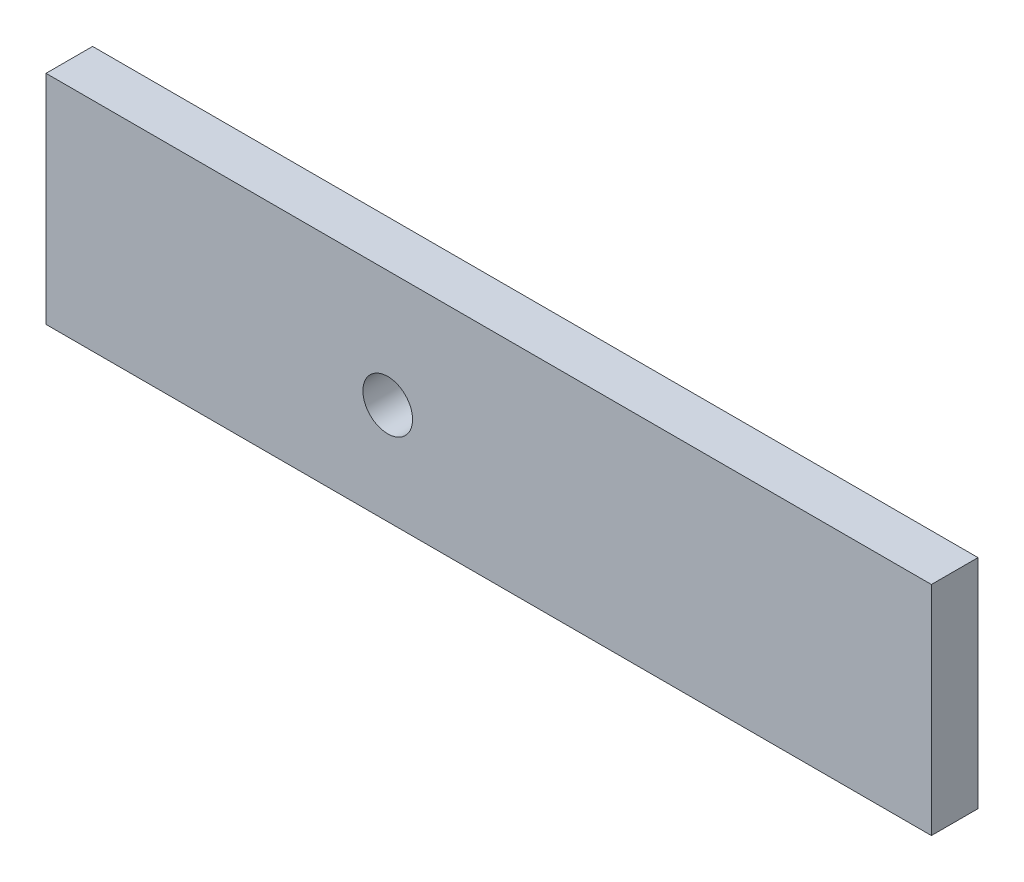
ISO-10303-21;
HEADER;
FILE_DESCRIPTION(('STEP AP214'),'2;1');
FILE_NAME('part.step','',(''),(''),'','','');
FILE_SCHEMA(('AUTOMOTIVE_DESIGN { 1 0 10303 214 1 1 1 1 }'));
ENDSEC;
DATA;
#1=APPLICATION_CONTEXT('core data for automotive mechanical design processes');
#2=APPLICATION_PROTOCOL_DEFINITION('international standard','automotive_design',2000,#1);
#3=PRODUCT_CONTEXT('',#1,'mechanical');
#4=PRODUCT('Part','Part','',(#3));
#5=PRODUCT_RELATED_PRODUCT_CATEGORY('part','',(#4));
#6=PRODUCT_DEFINITION_FORMATION('','',#4);
#7=PRODUCT_DEFINITION_CONTEXT('part definition',#1,'design');
#8=PRODUCT_DEFINITION('design','',#6,#7);
#9=PRODUCT_DEFINITION_SHAPE('','',#8);
#10=(LENGTH_UNIT() NAMED_UNIT(*) SI_UNIT(.MILLI.,.METRE.));
#11=(NAMED_UNIT(*) PLANE_ANGLE_UNIT() SI_UNIT($,.RADIAN.));
#12=(NAMED_UNIT(*) SI_UNIT($,.STERADIAN.) SOLID_ANGLE_UNIT());
#13=UNCERTAINTY_MEASURE_WITH_UNIT(LENGTH_MEASURE(1.E-05),#10,'distance_accuracy_value','');
#14=(GEOMETRIC_REPRESENTATION_CONTEXT(3) GLOBAL_UNCERTAINTY_ASSIGNED_CONTEXT((#13)) GLOBAL_UNIT_ASSIGNED_CONTEXT((#10,
#11,#12)) REPRESENTATION_CONTEXT('',''));
#15=CARTESIAN_POINT('',(0.,0.,0.));
#16=DIRECTION('',(0.,0.,1.));
#17=DIRECTION('',(1.,0.,0.));
#18=AXIS2_PLACEMENT_3D('',#15,#16,#17);
#19=CARTESIAN_POINT('',(-10.4,0.799999999999996,1.5));
#20=DIRECTION('',(-1.,0.,0.));
#21=DIRECTION('',(0.,0.,1.));
#22=AXIS2_PLACEMENT_3D('',#19,#20,#21);
#23=PLANE('',#22);
#24=DIRECTION('',(0.,1.,0.));
#25=VECTOR('',#24,1.);
#26=CARTESIAN_POINT('',(-10.4,0.799999999999996,0.));
#27=LINE('',#26,#25);
#28=CARTESIAN_POINT('',(-10.4,0.799999999999996,0.));
#29=VERTEX_POINT('',#28);
#30=CARTESIAN_POINT('',(-10.4,7.8,0.));
#31=VERTEX_POINT('',#30);
#32=EDGE_CURVE('E104',#29,#31,#27,.T.);
#33=ORIENTED_EDGE('',*,*,#32,.F.);
#34=DIRECTION('',(0.,0.,-1.));
#35=VECTOR('',#34,1.);
#36=CARTESIAN_POINT('',(-10.4,0.799999999999996,1.5));
#37=LINE('',#36,#35);
#38=CARTESIAN_POINT('',(-10.4,0.799999999999996,1.5));
#39=VERTEX_POINT('',#38);
#40=EDGE_CURVE('E11',#39,#29,#37,.T.);
#41=ORIENTED_EDGE('',*,*,#40,.F.);
#42=DIRECTION('',(0.,1.,0.));
#43=VECTOR('',#42,1.);
#44=CARTESIAN_POINT('',(-10.4,0.799999999999996,1.5));
#45=LINE('',#44,#43);
#46=CARTESIAN_POINT('',(-10.4,7.8,1.5));
#47=VERTEX_POINT('',#46);
#48=EDGE_CURVE('E97',#39,#47,#45,.T.);
#49=ORIENTED_EDGE('',*,*,#48,.T.);
#50=DIRECTION('',(0.,0.,-1.));
#51=VECTOR('',#50,1.);
#52=CARTESIAN_POINT('',(-10.4,7.8,1.5));
#53=LINE('',#52,#51);
#54=EDGE_CURVE('E42',#47,#31,#53,.T.);
#55=ORIENTED_EDGE('',*,*,#54,.T.);
#56=EDGE_LOOP('',(#33,#41,#49,#55));
#57=FACE_BOUND('',#56,.T.);
#58=ADVANCED_FACE('F39',(#57),#23,.T.);
#59=CARTESIAN_POINT('',(18.1,0.799999999999999,1.5));
#60=DIRECTION('',(0.,-1.,0.));
#61=DIRECTION('',(1.,0.,0.));
#62=AXIS2_PLACEMENT_3D('',#59,#60,#61);
#63=PLANE('',#62);
#64=DIRECTION('',(-1.,0.,0.));
#65=VECTOR('',#64,1.);
#66=CARTESIAN_POINT('',(18.1,0.799999999999999,0.));
#67=LINE('',#66,#65);
#68=CARTESIAN_POINT('',(18.1,0.799999999999999,0.));
#69=VERTEX_POINT('',#68);
#70=EDGE_CURVE('E99',#69,#29,#67,.T.);
#71=ORIENTED_EDGE('',*,*,#70,.F.);
#72=DIRECTION('',(0.,0.,-1.));
#73=VECTOR('',#72,1.);
#74=CARTESIAN_POINT('',(18.1,0.799999999999999,1.5));
#75=LINE('',#74,#73);
#76=CARTESIAN_POINT('',(18.1,0.799999999999999,1.5));
#77=VERTEX_POINT('',#76);
#78=EDGE_CURVE('E48',#77,#69,#75,.T.);
#79=ORIENTED_EDGE('',*,*,#78,.F.);
#80=DIRECTION('',(-1.,0.,0.));
#81=VECTOR('',#80,1.);
#82=CARTESIAN_POINT('',(18.1,0.799999999999999,1.5));
#83=LINE('',#82,#81);
#84=EDGE_CURVE('E94',#77,#39,#83,.T.);
#85=ORIENTED_EDGE('',*,*,#84,.T.);
#86=ORIENTED_EDGE('',*,*,#40,.T.);
#87=EDGE_LOOP('',(#71,#79,#85,#86));
#88=FACE_BOUND('',#87,.T.);
#89=ADVANCED_FACE('F115',(#88),#63,.T.);
#90=CARTESIAN_POINT('',(18.1,7.8,1.5));
#91=DIRECTION('',(1.,0.,0.));
#92=DIRECTION('',(0.,0.,-1.));
#93=AXIS2_PLACEMENT_3D('',#90,#91,#92);
#94=PLANE('',#93);
#95=DIRECTION('',(0.,-1.,0.));
#96=VECTOR('',#95,1.);
#97=CARTESIAN_POINT('',(18.1,7.8,0.));
#98=LINE('',#97,#96);
#99=CARTESIAN_POINT('',(18.1,7.8,0.));
#100=VERTEX_POINT('',#99);
#101=EDGE_CURVE('E89',#100,#69,#98,.T.);
#102=ORIENTED_EDGE('',*,*,#101,.F.);
#103=DIRECTION('',(0.,0.,-1.));
#104=VECTOR('',#103,1.);
#105=CARTESIAN_POINT('',(18.1,7.8,1.5));
#106=LINE('',#105,#104);
#107=CARTESIAN_POINT('',(18.1,7.8,1.5));
#108=VERTEX_POINT('',#107);
#109=EDGE_CURVE('E84',#108,#100,#106,.T.);
#110=ORIENTED_EDGE('',*,*,#109,.F.);
#111=DIRECTION('',(0.,-1.,0.));
#112=VECTOR('',#111,1.);
#113=CARTESIAN_POINT('',(18.1,7.8,1.5));
#114=LINE('',#113,#112);
#115=EDGE_CURVE('E87',#108,#77,#114,.T.);
#116=ORIENTED_EDGE('',*,*,#115,.T.);
#117=ORIENTED_EDGE('',*,*,#78,.T.);
#118=EDGE_LOOP('',(#102,#110,#116,#117));
#119=FACE_BOUND('',#118,.T.);
#120=ADVANCED_FACE('F86',(#119),#94,.T.);
#121=CARTESIAN_POINT('',(-10.4,7.8,1.5));
#122=DIRECTION('',(0.,1.,0.));
#123=DIRECTION('',(0.,0.,1.));
#124=AXIS2_PLACEMENT_3D('',#121,#122,#123);
#125=PLANE('',#124);
#126=DIRECTION('',(1.,0.,0.));
#127=VECTOR('',#126,1.);
#128=CARTESIAN_POINT('',(-10.4,7.8,0.));
#129=LINE('',#128,#127);
#130=EDGE_CURVE('E107',#31,#100,#129,.T.);
#131=ORIENTED_EDGE('',*,*,#130,.F.);
#132=ORIENTED_EDGE('',*,*,#54,.F.);
#133=DIRECTION('',(1.,0.,0.));
#134=VECTOR('',#133,1.);
#135=CARTESIAN_POINT('',(-10.4,7.8,1.5));
#136=LINE('',#135,#134);
#137=EDGE_CURVE('E93',#47,#108,#136,.T.);
#138=ORIENTED_EDGE('',*,*,#137,.T.);
#139=ORIENTED_EDGE('',*,*,#109,.T.);
#140=EDGE_LOOP('',(#131,#132,#138,#139));
#141=FACE_BOUND('',#140,.T.);
#142=ADVANCED_FACE('F96',(#141),#125,.T.);
#143=CARTESIAN_POINT('',(0.,0.,1.5));
#144=DIRECTION('',(0.,0.,-1.));
#145=DIRECTION('',(-1.,0.,0.));
#146=AXIS2_PLACEMENT_3D('',#143,#144,#145);
#147=PLANE('',#146);
#148=CARTESIAN_POINT('',(0.600000000000001,4.05,1.5));
#149=DIRECTION('',(0.,0.,-1.));
#150=DIRECTION('',(-1.,0.,0.));
#151=AXIS2_PLACEMENT_3D('',#148,#149,#150);
#152=CIRCLE('',#151,0.799999999999999);
#153=CARTESIAN_POINT('',(-0.199999999999998,4.05,1.5));
#154=VERTEX_POINT('',#153);
#155=EDGE_CURVE('E151',#154,#154,#152,.T.);
#156=ORIENTED_EDGE('',*,*,#155,.T.);
#157=EDGE_LOOP('',(#156));
#158=FACE_BOUND('',#157,.T.);
#159=ORIENTED_EDGE('',*,*,#48,.F.);
#160=ORIENTED_EDGE('',*,*,#84,.F.);
#161=ORIENTED_EDGE('',*,*,#115,.F.);
#162=ORIENTED_EDGE('',*,*,#137,.F.);
#163=EDGE_LOOP('',(#159,#160,#161,#162));
#164=FACE_BOUND('',#163,.T.);
#165=ADVANCED_FACE('F92',(#158,#164),#147,.F.);
#166=CARTESIAN_POINT('',(0.,0.,0.));
#167=DIRECTION('',(0.,0.,-1.));
#168=DIRECTION('',(-1.,0.,0.));
#169=AXIS2_PLACEMENT_3D('',#166,#167,#168);
#170=PLANE('',#169);
#171=CARTESIAN_POINT('',(0.600000000000001,4.05,0.));
#172=DIRECTION('',(0.,0.,-1.));
#173=DIRECTION('',(-1.,0.,0.));
#174=AXIS2_PLACEMENT_3D('',#171,#172,#173);
#175=CIRCLE('',#174,0.799999999999999);
#176=CARTESIAN_POINT('',(-0.199999999999997,4.05,0.));
#177=VERTEX_POINT('',#176);
#178=EDGE_CURVE('E154',#177,#177,#175,.T.);
#179=ORIENTED_EDGE('',*,*,#178,.F.);
#180=EDGE_LOOP('',(#179));
#181=FACE_BOUND('',#180,.T.);
#182=CARTESIAN_POINT('',(11.1,3.3,0.));
#183=DIRECTION('',(0.,0.,-1.));
#184=DIRECTION('',(-1.,0.,0.));
#185=AXIS2_PLACEMENT_3D('',#182,#183,#184);
#186=CIRCLE('',#185,0.725);
#187=CARTESIAN_POINT('',(10.375,3.3,0.));
#188=VERTEX_POINT('',#187);
#189=EDGE_CURVE('E156',#188,#188,#186,.T.);
#190=ORIENTED_EDGE('',*,*,#189,.F.);
#191=EDGE_LOOP('',(#190));
#192=FACE_BOUND('',#191,.T.);
#193=ORIENTED_EDGE('',*,*,#32,.T.);
#194=ORIENTED_EDGE('',*,*,#130,.T.);
#195=ORIENTED_EDGE('',*,*,#101,.T.);
#196=ORIENTED_EDGE('',*,*,#70,.T.);
#197=EDGE_LOOP('',(#193,#194,#195,#196));
#198=FACE_BOUND('',#197,.T.);
#199=ADVANCED_FACE('F114',(#181,#192,#198),#170,.T.);
#200=CARTESIAN_POINT('',(11.1,3.3,-4.35060966544099));
#201=DIRECTION('',(0.,0.,1.));
#202=DIRECTION('',(1.,0.,0.));
#203=AXIS2_PLACEMENT_3D('',#200,#201,#202);
#204=CYLINDRICAL_SURFACE('',#203,0.725);
#205=CARTESIAN_POINT('',(11.1,3.3,-1.9));
#206=DIRECTION('',(0.,0.,1.));
#207=DIRECTION('',(0.,-1.,0.));
#208=AXIS2_PLACEMENT_3D('',#205,#206,#207);
#209=CIRCLE('',#208,0.725);
#210=CARTESIAN_POINT('',(11.1,2.575,-1.9));
#211=VERTEX_POINT('',#210);
#212=EDGE_CURVE('E108',#211,#211,#209,.T.);
#213=ORIENTED_EDGE('',*,*,#212,.T.);
#214=EDGE_LOOP('',(#213));
#215=FACE_BOUND('',#214,.T.);
#216=ORIENTED_EDGE('',*,*,#189,.T.);
#217=EDGE_LOOP('',(#216));
#218=FACE_BOUND('',#217,.T.);
#219=ADVANCED_FACE('F133',(#215,#218),#204,.T.);
#220=CARTESIAN_POINT('',(0.,0.,-1.9));
#221=DIRECTION('',(0.,0.,1.));
#222=DIRECTION('',(-1.,0.,0.));
#223=AXIS2_PLACEMENT_3D('',#220,#221,#222);
#224=PLANE('',#223);
#225=ORIENTED_EDGE('',*,*,#212,.F.);
#226=EDGE_LOOP('',(#225));
#227=FACE_BOUND('',#226,.T.);
#228=ADVANCED_FACE('F139',(#227),#224,.F.);
#229=CARTESIAN_POINT('',(0.600000000000001,4.05,0.));
#230=DIRECTION('',(0.,0.,-1.));
#231=DIRECTION('',(-1.,0.,0.));
#232=AXIS2_PLACEMENT_3D('',#229,#230,#231);
#233=CYLINDRICAL_SURFACE('',#232,0.799999999999999);
#234=ORIENTED_EDGE('',*,*,#155,.F.);
#235=EDGE_LOOP('',(#234));
#236=FACE_BOUND('',#235,.T.);
#237=ORIENTED_EDGE('',*,*,#178,.T.);
#238=EDGE_LOOP('',(#237));
#239=FACE_BOUND('',#238,.T.);
#240=ADVANCED_FACE('F143',(#236,#239),#233,.F.);
#241=CLOSED_SHELL('',(#58,#89,#120,#142,#165,#199,#219,#228,#240));
#242=MANIFOLD_SOLID_BREP('B2',#241);
#243=ADVANCED_BREP_SHAPE_REPRESENTATION('',(#18,#242),#14);
#244=SHAPE_DEFINITION_REPRESENTATION(#9,#243);
ENDSEC;
END-ISO-10303-21;
